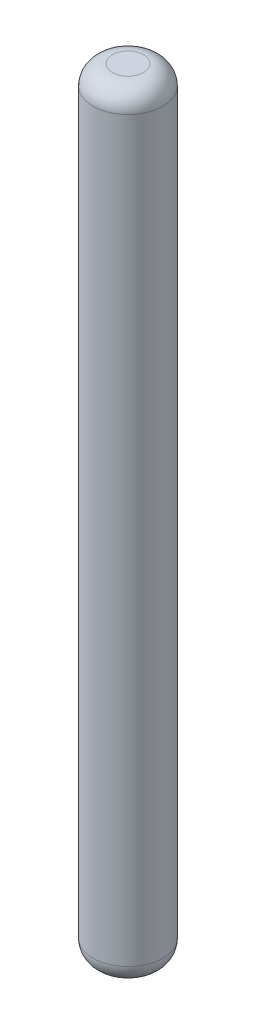
ISO-10303-21;
HEADER;
FILE_DESCRIPTION(('STEP AP214'),'2;1');
FILE_NAME('part.step','',(''),(''),'','','');
FILE_SCHEMA(('AUTOMOTIVE_DESIGN { 1 0 10303 214 1 1 1 1 }'));
ENDSEC;
DATA;
#1=APPLICATION_CONTEXT('core data for automotive mechanical design processes');
#2=APPLICATION_PROTOCOL_DEFINITION('international standard','automotive_design',2000,#1);
#3=PRODUCT_CONTEXT('',#1,'mechanical');
#4=PRODUCT('Part','Part','',(#3));
#5=PRODUCT_RELATED_PRODUCT_CATEGORY('part','',(#4));
#6=PRODUCT_DEFINITION_FORMATION('','',#4);
#7=PRODUCT_DEFINITION_CONTEXT('part definition',#1,'design');
#8=PRODUCT_DEFINITION('design','',#6,#7);
#9=PRODUCT_DEFINITION_SHAPE('','',#8);
#10=(LENGTH_UNIT() NAMED_UNIT(*) SI_UNIT(.MILLI.,.METRE.));
#11=(NAMED_UNIT(*) PLANE_ANGLE_UNIT() SI_UNIT($,.RADIAN.));
#12=(NAMED_UNIT(*) SI_UNIT($,.STERADIAN.) SOLID_ANGLE_UNIT());
#13=UNCERTAINTY_MEASURE_WITH_UNIT(LENGTH_MEASURE(1.E-05),#10,'distance_accuracy_value','');
#14=(GEOMETRIC_REPRESENTATION_CONTEXT(3) GLOBAL_UNCERTAINTY_ASSIGNED_CONTEXT((#13)) GLOBAL_UNIT_ASSIGNED_CONTEXT((#10,
#11,#12)) REPRESENTATION_CONTEXT('',''));
#15=CARTESIAN_POINT('',(0.,0.,0.));
#16=DIRECTION('',(0.,0.,1.));
#17=DIRECTION('',(1.,0.,0.));
#18=AXIS2_PLACEMENT_3D('',#15,#16,#17);
#19=CARTESIAN_POINT('',(0.,25.4,0.));
#20=DIRECTION('',(0.,-1.,0.));
#21=DIRECTION('',(0.,0.,-1.));
#22=AXIS2_PLACEMENT_3D('',#19,#20,#21);
#23=CYLINDRICAL_SURFACE('',#22,1.143);
#24=CARTESIAN_POINT('',(0.,0.635,0.));
#25=DIRECTION('',(0.,1.,0.));
#26=DIRECTION('',(0.,0.,1.));
#27=AXIS2_PLACEMENT_3D('',#24,#25,#26);
#28=CIRCLE('',#27,1.143);
#29=CARTESIAN_POINT('',(0.,0.635,1.143));
#30=VERTEX_POINT('',#29);
#31=EDGE_CURVE('E46',#30,#30,#28,.T.);
#32=ORIENTED_EDGE('',*,*,#31,.T.);
#33=EDGE_LOOP('',(#32));
#34=FACE_BOUND('',#33,.T.);
#35=CARTESIAN_POINT('',(0.,24.765,0.));
#36=DIRECTION('',(0.,1.,0.));
#37=DIRECTION('',(0.,0.,1.));
#38=AXIS2_PLACEMENT_3D('',#35,#36,#37);
#39=CIRCLE('',#38,1.143);
#40=CARTESIAN_POINT('',(0.,24.765,1.143));
#41=VERTEX_POINT('',#40);
#42=EDGE_CURVE('E50',#41,#41,#39,.F.);
#43=ORIENTED_EDGE('',*,*,#42,.T.);
#44=EDGE_LOOP('',(#43));
#45=FACE_BOUND('',#44,.T.);
#46=ADVANCED_FACE('F35',(#34,#45),#23,.T.);
#47=CARTESIAN_POINT('',(0.,25.4,0.));
#48=DIRECTION('',(0.,1.,0.));
#49=DIRECTION('',(0.,0.,1.));
#50=AXIS2_PLACEMENT_3D('',#47,#48,#49);
#51=PLANE('',#50);
#52=CARTESIAN_POINT('',(0.,25.4,0.));
#53=DIRECTION('',(0.,1.,0.));
#54=DIRECTION('',(0.,0.,1.));
#55=AXIS2_PLACEMENT_3D('',#52,#53,#54);
#56=CIRCLE('',#55,0.508);
#57=CARTESIAN_POINT('',(0.,25.4,0.508));
#58=VERTEX_POINT('',#57);
#59=EDGE_CURVE('E10',#58,#58,#56,.T.);
#60=ORIENTED_EDGE('',*,*,#59,.T.);
#61=EDGE_LOOP('',(#60));
#62=FACE_BOUND('',#61,.T.);
#63=ADVANCED_FACE('F66',(#62),#51,.T.);
#64=CARTESIAN_POINT('',(0.,0.,0.));
#65=DIRECTION('',(0.,1.,0.));
#66=DIRECTION('',(0.,0.,1.));
#67=AXIS2_PLACEMENT_3D('',#64,#65,#66);
#68=PLANE('',#67);
#69=CARTESIAN_POINT('',(0.,0.,0.));
#70=DIRECTION('',(0.,1.,0.));
#71=DIRECTION('',(0.,0.,1.));
#72=AXIS2_PLACEMENT_3D('',#69,#70,#71);
#73=CIRCLE('',#72,0.508);
#74=CARTESIAN_POINT('',(0.,0.,0.508));
#75=VERTEX_POINT('',#74);
#76=EDGE_CURVE('E42',#75,#75,#73,.F.);
#77=ORIENTED_EDGE('',*,*,#76,.T.);
#78=EDGE_LOOP('',(#77));
#79=FACE_BOUND('',#78,.T.);
#80=ADVANCED_FACE('F63',(#79),#68,.F.);
#81=CARTESIAN_POINT('',(0.,0.635,0.));
#82=DIRECTION('',(0.,1.,0.));
#83=DIRECTION('',(0.,0.,1.));
#84=AXIS2_PLACEMENT_3D('',#81,#82,#83);
#85=DEGENERATE_TOROIDAL_SURFACE('',#84,0.508,0.635,.T.);
#86=ORIENTED_EDGE('',*,*,#76,.F.);
#87=EDGE_LOOP('',(#86));
#88=FACE_BOUND('',#87,.T.);
#89=ORIENTED_EDGE('',*,*,#31,.F.);
#90=EDGE_LOOP('',(#89));
#91=FACE_BOUND('',#90,.T.);
#92=ADVANCED_FACE('F59',(#88,#91),#85,.T.);
#93=CARTESIAN_POINT('',(0.,24.765,0.));
#94=DIRECTION('',(0.,1.,0.));
#95=DIRECTION('',(0.,0.,1.));
#96=AXIS2_PLACEMENT_3D('',#93,#94,#95);
#97=DEGENERATE_TOROIDAL_SURFACE('',#96,0.508,0.635,.T.);
#98=ORIENTED_EDGE('',*,*,#42,.F.);
#99=EDGE_LOOP('',(#98));
#100=FACE_BOUND('',#99,.T.);
#101=ORIENTED_EDGE('',*,*,#59,.F.);
#102=EDGE_LOOP('',(#101));
#103=FACE_BOUND('',#102,.T.);
#104=ADVANCED_FACE('F37',(#100,#103),#97,.T.);
#105=CLOSED_SHELL('',(#46,#63,#80,#92,#104));
#106=MANIFOLD_SOLID_BREP('B2',#105);
#107=ADVANCED_BREP_SHAPE_REPRESENTATION('',(#18,#106),#14);
#108=SHAPE_DEFINITION_REPRESENTATION(#9,#107);
ENDSEC;
END-ISO-10303-21;
